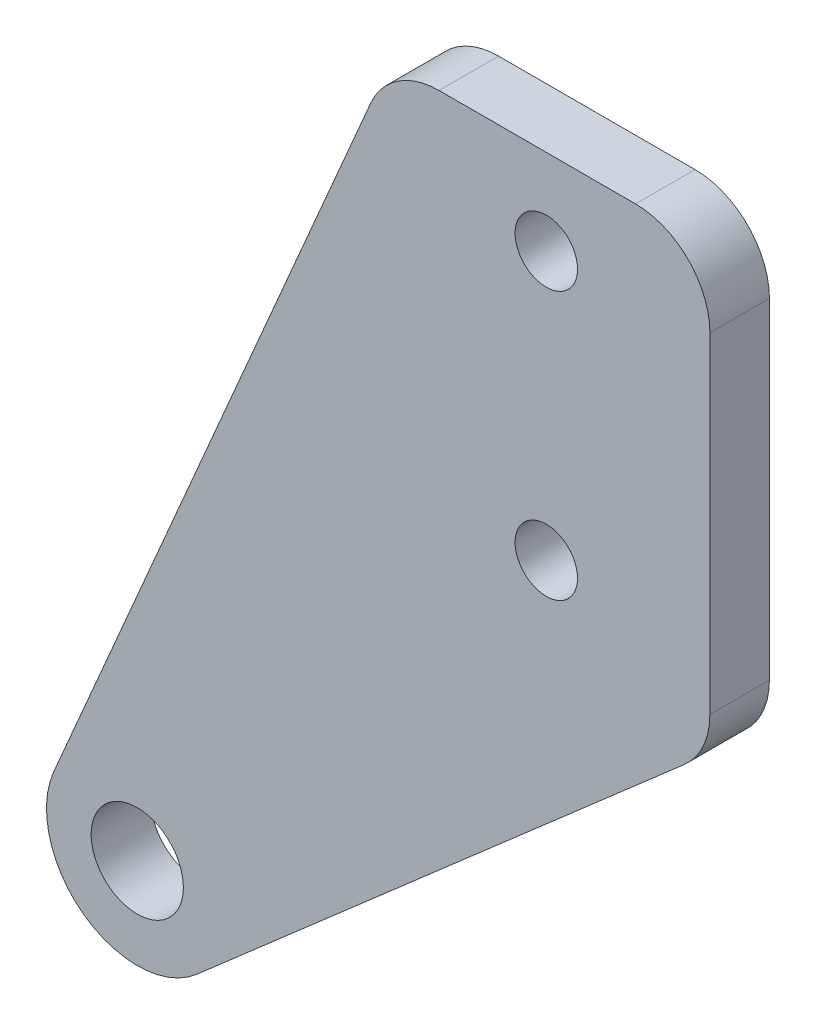
ISO-10303-21;
HEADER;
FILE_DESCRIPTION(('STEP AP214'),'2;1');
FILE_NAME('part.step','',(''),(''),'','','');
FILE_SCHEMA(('AUTOMOTIVE_DESIGN { 1 0 10303 214 1 1 1 1 }'));
ENDSEC;
DATA;
#1=APPLICATION_CONTEXT('core data for automotive mechanical design processes');
#2=APPLICATION_PROTOCOL_DEFINITION('international standard','automotive_design',2000,#1);
#3=PRODUCT_CONTEXT('',#1,'mechanical');
#4=PRODUCT('Part','Part','',(#3));
#5=PRODUCT_RELATED_PRODUCT_CATEGORY('part','',(#4));
#6=PRODUCT_DEFINITION_FORMATION('','',#4);
#7=PRODUCT_DEFINITION_CONTEXT('part definition',#1,'design');
#8=PRODUCT_DEFINITION('design','',#6,#7);
#9=PRODUCT_DEFINITION_SHAPE('','',#8);
#10=(LENGTH_UNIT() NAMED_UNIT(*) SI_UNIT(.MILLI.,.METRE.));
#11=(NAMED_UNIT(*) PLANE_ANGLE_UNIT() SI_UNIT($,.RADIAN.));
#12=(NAMED_UNIT(*) SI_UNIT($,.STERADIAN.) SOLID_ANGLE_UNIT());
#13=UNCERTAINTY_MEASURE_WITH_UNIT(LENGTH_MEASURE(1.E-05),#10,'distance_accuracy_value','');
#14=(GEOMETRIC_REPRESENTATION_CONTEXT(3) GLOBAL_UNCERTAINTY_ASSIGNED_CONTEXT((#13)) GLOBAL_UNIT_ASSIGNED_CONTEXT((#10,
#11,#12)) REPRESENTATION_CONTEXT('',''));
#15=CARTESIAN_POINT('',(0.,0.,0.));
#16=DIRECTION('',(0.,0.,1.));
#17=DIRECTION('',(1.,0.,0.));
#18=AXIS2_PLACEMENT_3D('',#15,#16,#17);
#19=CARTESIAN_POINT('',(10.3331114739695,-11.8414541399534,4.));
#20=DIRECTION('',(-0.657489150580782,0.753464011661182,0.));
#21=DIRECTION('',(-0.753464011661182,-0.657489150580782,0.));
#22=AXIS2_PLACEMENT_3D('',#19,#20,#21);
#23=PLANE('',#22);
#24=DIRECTION('',(0.753464011661182,0.657489150580782,0.));
#25=VECTOR('',#24,1.);
#26=CARTESIAN_POINT('',(10.3331114739695,-11.8414541399534,0.));
#27=LINE('',#26,#25);
#28=CARTESIAN_POINT('',(-27.4893161814572,-44.8461304711332,0.));
#29=VERTEX_POINT('',#28);
#30=CARTESIAN_POINT('',(5.28744575290391,-16.2444122344533,0.));
#31=VERTEX_POINT('',#30);
#32=EDGE_CURVE('E138',#29,#31,#27,.T.);
#33=ORIENTED_EDGE('',*,*,#32,.T.);
#34=DIRECTION('',(0.,0.,-1.));
#35=VECTOR('',#34,1.);
#36=CARTESIAN_POINT('',(5.28744575290391,-16.2444122344533,4.));
#37=LINE('',#36,#35);
#38=CARTESIAN_POINT('',(5.28744575290391,-16.2444122344533,4.));
#39=VERTEX_POINT('',#38);
#40=EDGE_CURVE('E46',#31,#39,#37,.F.);
#41=ORIENTED_EDGE('',*,*,#40,.T.);
#42=DIRECTION('',(0.753464011661182,0.657489150580782,0.));
#43=VECTOR('',#42,1.);
#44=CARTESIAN_POINT('',(10.3331114739695,-11.8414541399534,4.));
#45=LINE('',#44,#43);
#46=CARTESIAN_POINT('',(-27.4893161814572,-44.8461304711332,4.));
#47=VERTEX_POINT('',#46);
#48=EDGE_CURVE('E158',#47,#39,#45,.T.);
#49=ORIENTED_EDGE('',*,*,#48,.F.);
#50=DIRECTION('',(0.,0.,-1.));
#51=VECTOR('',#50,1.);
#52=CARTESIAN_POINT('',(-27.4893161814572,-44.8461304711332,4.));
#53=LINE('',#52,#51);
#54=EDGE_CURVE('E122',#47,#29,#53,.T.);
#55=ORIENTED_EDGE('',*,*,#54,.T.);
#56=EDGE_LOOP('',(#33,#41,#49,#55));
#57=FACE_BOUND('',#56,.T.);
#58=ADVANCED_FACE('F38',(#57),#23,.F.);
#59=CARTESIAN_POINT('',(7.,0.,4.));
#60=DIRECTION('',(-1.,0.,0.));
#61=DIRECTION('',(0.,0.,1.));
#62=AXIS2_PLACEMENT_3D('',#59,#60,#61);
#63=PLANE('',#62);
#64=DIRECTION('',(0.,1.,0.));
#65=VECTOR('',#64,1.);
#66=CARTESIAN_POINT('',(7.,0.,0.));
#67=LINE('',#66,#65);
#68=CARTESIAN_POINT('',(7.,-12.4770921761474,0.));
#69=VERTEX_POINT('',#68);
#70=CARTESIAN_POINT('',(7.,9.75,0.));
#71=VERTEX_POINT('',#70);
#72=EDGE_CURVE('E140',#69,#71,#67,.T.);
#73=ORIENTED_EDGE('',*,*,#72,.T.);
#74=DIRECTION('',(0.,0.,-1.));
#75=VECTOR('',#74,1.);
#76=CARTESIAN_POINT('',(7.,9.75,4.));
#77=LINE('',#76,#75);
#78=CARTESIAN_POINT('',(7.,9.75,4.));
#79=VERTEX_POINT('',#78);
#80=EDGE_CURVE('E173',#71,#79,#77,.F.);
#81=ORIENTED_EDGE('',*,*,#80,.T.);
#82=DIRECTION('',(0.,1.,0.));
#83=VECTOR('',#82,1.);
#84=CARTESIAN_POINT('',(7.,0.,4.));
#85=LINE('',#84,#83);
#86=CARTESIAN_POINT('',(7.,-12.4770921761474,4.));
#87=VERTEX_POINT('',#86);
#88=EDGE_CURVE('E182',#87,#79,#85,.T.);
#89=ORIENTED_EDGE('',*,*,#88,.F.);
#90=DIRECTION('',(0.,0.,-1.));
#91=VECTOR('',#90,1.);
#92=CARTESIAN_POINT('',(7.,-12.4770921761474,4.));
#93=LINE('',#92,#91);
#94=EDGE_CURVE('E170',#87,#69,#93,.T.);
#95=ORIENTED_EDGE('',*,*,#94,.T.);
#96=EDGE_LOOP('',(#73,#81,#89,#95));
#97=FACE_BOUND('',#96,.T.);
#98=ADVANCED_FACE('F196',(#97),#63,.F.);
#99=CARTESIAN_POINT('',(0.,14.75,4.));
#100=DIRECTION('',(0.,1.,0.));
#101=DIRECTION('',(0.,0.,1.));
#102=AXIS2_PLACEMENT_3D('',#99,#100,#101);
#103=PLANE('',#102);
#104=DIRECTION('',(1.,0.,0.));
#105=VECTOR('',#104,1.);
#106=CARTESIAN_POINT('',(0.,14.75,4.));
#107=LINE('',#106,#105);
#108=CARTESIAN_POINT('',(-11.2067714502846,14.75,4.));
#109=VERTEX_POINT('',#108);
#110=CARTESIAN_POINT('',(2.,14.75,4.));
#111=VERTEX_POINT('',#110);
#112=EDGE_CURVE('E112',#109,#111,#107,.T.);
#113=ORIENTED_EDGE('',*,*,#112,.T.);
#114=DIRECTION('',(0.,0.,-1.));
#115=VECTOR('',#114,1.);
#116=CARTESIAN_POINT('',(2.,14.75,0.));
#117=LINE('',#116,#115);
#118=CARTESIAN_POINT('',(2.,14.75,0.));
#119=VERTEX_POINT('',#118);
#120=EDGE_CURVE('E161',#111,#119,#117,.T.);
#121=ORIENTED_EDGE('',*,*,#120,.T.);
#122=DIRECTION('',(1.,0.,0.));
#123=VECTOR('',#122,1.);
#124=CARTESIAN_POINT('',(0.,14.75,0.));
#125=LINE('',#124,#123);
#126=CARTESIAN_POINT('',(-11.2067714502846,14.75,0.));
#127=VERTEX_POINT('',#126);
#128=EDGE_CURVE('E143',#127,#119,#125,.T.);
#129=ORIENTED_EDGE('',*,*,#128,.F.);
#130=DIRECTION('',(0.,0.,-1.));
#131=VECTOR('',#130,1.);
#132=CARTESIAN_POINT('',(-11.2067714502846,14.75,4.));
#133=LINE('',#132,#131);
#134=EDGE_CURVE('E121',#127,#109,#133,.F.);
#135=ORIENTED_EDGE('',*,*,#134,.T.);
#136=EDGE_LOOP('',(#113,#121,#129,#135));
#137=FACE_BOUND('',#136,.T.);
#138=ADVANCED_FACE('F187',(#137),#103,.T.);
#139=CARTESIAN_POINT('',(-17.5901518014723,7.56043387637797,4.));
#140=DIRECTION('',(0.918732319934744,-0.394880898888921,0.));
#141=DIRECTION('',(0.394880898888921,0.918732319934745,0.));
#142=AXIS2_PLACEMENT_3D('',#139,#140,#141);
#143=PLANE('',#142);
#144=DIRECTION('',(-0.394880898888921,-0.918732319934745,0.));
#145=VECTOR('',#144,1.);
#146=CARTESIAN_POINT('',(-17.5901518014723,7.56043387637797,4.));
#147=LINE('',#146,#145);
#148=CARTESIAN_POINT('',(-15.8004330499583,11.7244044944446,4.));
#149=VERTEX_POINT('',#148);
#150=CARTESIAN_POINT('',(-37.104267151602,-37.8412265167776,4.));
#151=VERTEX_POINT('',#150);
#152=EDGE_CURVE('E102',#149,#151,#147,.T.);
#153=ORIENTED_EDGE('',*,*,#152,.F.);
#154=DIRECTION('',(0.,0.,-1.));
#155=VECTOR('',#154,1.);
#156=CARTESIAN_POINT('',(-15.8004330499583,11.7244044944446,0.));
#157=LINE('',#156,#155);
#158=CARTESIAN_POINT('',(-15.8004330499583,11.7244044944446,0.));
#159=VERTEX_POINT('',#158);
#160=EDGE_CURVE('E11',#149,#159,#157,.T.);
#161=ORIENTED_EDGE('',*,*,#160,.T.);
#162=DIRECTION('',(-0.394880898888921,-0.918732319934745,0.));
#163=VECTOR('',#162,1.);
#164=CARTESIAN_POINT('',(-17.5901518014723,7.56043387637797,0.));
#165=LINE('',#164,#163);
#166=CARTESIAN_POINT('',(-37.104267151602,-37.8412265167776,0.));
#167=VERTEX_POINT('',#166);
#168=EDGE_CURVE('E118',#159,#167,#165,.T.);
#169=ORIENTED_EDGE('',*,*,#168,.T.);
#170=DIRECTION('',(0.,0.,-1.));
#171=VECTOR('',#170,1.);
#172=CARTESIAN_POINT('',(-37.104267151602,-37.8412265167776,4.));
#173=LINE('',#172,#171);
#174=EDGE_CURVE('E115',#151,#167,#173,.T.);
#175=ORIENTED_EDGE('',*,*,#174,.F.);
#176=EDGE_LOOP('',(#153,#161,#169,#175));
#177=FACE_BOUND('',#176,.T.);
#178=ADVANCED_FACE('F116',(#177),#143,.F.);
#179=CARTESIAN_POINT('',(-4.,9.,4.));
#180=DIRECTION('',(0.,0.,-1.));
#181=DIRECTION('',(-1.,0.,0.));
#182=AXIS2_PLACEMENT_3D('',#179,#180,#181);
#183=CYLINDRICAL_SURFACE('',#182,2.1);
#184=CARTESIAN_POINT('',(-4.,9.,4.));
#185=DIRECTION('',(0.,0.,1.));
#186=DIRECTION('',(1.,0.,0.));
#187=AXIS2_PLACEMENT_3D('',#184,#185,#186);
#188=CIRCLE('',#187,2.1);
#189=CARTESIAN_POINT('',(-1.9,9.,4.));
#190=VERTEX_POINT('',#189);
#191=EDGE_CURVE('E129',#190,#190,#188,.T.);
#192=ORIENTED_EDGE('',*,*,#191,.T.);
#193=EDGE_LOOP('',(#192));
#194=FACE_BOUND('',#193,.T.);
#195=CARTESIAN_POINT('',(-4.,9.,0.));
#196=DIRECTION('',(0.,0.,1.));
#197=DIRECTION('',(1.,0.,0.));
#198=AXIS2_PLACEMENT_3D('',#195,#196,#197);
#199=CIRCLE('',#198,2.1);
#200=CARTESIAN_POINT('',(-1.9,9.,0.));
#201=VERTEX_POINT('',#200);
#202=EDGE_CURVE('E152',#201,#201,#199,.T.);
#203=ORIENTED_EDGE('',*,*,#202,.F.);
#204=EDGE_LOOP('',(#203));
#205=FACE_BOUND('',#204,.T.);
#206=ADVANCED_FACE('F259',(#194,#205),#183,.F.);
#207=CARTESIAN_POINT('',(-4.,-9.,4.));
#208=DIRECTION('',(0.,0.,-1.));
#209=DIRECTION('',(-1.,0.,0.));
#210=AXIS2_PLACEMENT_3D('',#207,#208,#209);
#211=CYLINDRICAL_SURFACE('',#210,2.1);
#212=CARTESIAN_POINT('',(-4.,-9.,4.));
#213=DIRECTION('',(0.,0.,1.));
#214=DIRECTION('',(1.,0.,0.));
#215=AXIS2_PLACEMENT_3D('',#212,#213,#214);
#216=CIRCLE('',#215,2.1);
#217=CARTESIAN_POINT('',(-1.9,-9.,4.));
#218=VERTEX_POINT('',#217);
#219=EDGE_CURVE('E126',#218,#218,#216,.T.);
#220=ORIENTED_EDGE('',*,*,#219,.T.);
#221=EDGE_LOOP('',(#220));
#222=FACE_BOUND('',#221,.T.);
#223=CARTESIAN_POINT('',(-4.,-9.,0.));
#224=DIRECTION('',(0.,0.,1.));
#225=DIRECTION('',(1.,0.,0.));
#226=AXIS2_PLACEMENT_3D('',#223,#224,#225);
#227=CIRCLE('',#226,2.1);
#228=CARTESIAN_POINT('',(-1.9,-9.,0.));
#229=VERTEX_POINT('',#228);
#230=EDGE_CURVE('E149',#229,#229,#227,.T.);
#231=ORIENTED_EDGE('',*,*,#230,.F.);
#232=EDGE_LOOP('',(#231));
#233=FACE_BOUND('',#232,.T.);
#234=ADVANCED_FACE('F295',(#222,#233),#211,.F.);
#235=CARTESIAN_POINT('',(-31.5,-40.25,4.));
#236=DIRECTION('',(0.,0.,-1.));
#237=DIRECTION('',(-1.,0.,0.));
#238=AXIS2_PLACEMENT_3D('',#235,#236,#237);
#239=CYLINDRICAL_SURFACE('',#238,6.1);
#240=CARTESIAN_POINT('',(-31.5,-40.25,0.));
#241=DIRECTION('',(0.,0.,1.));
#242=DIRECTION('',(1.,0.,0.));
#243=AXIS2_PLACEMENT_3D('',#240,#241,#242);
#244=CIRCLE('',#243,6.1);
#245=EDGE_CURVE('E147',#167,#29,#244,.T.);
#246=ORIENTED_EDGE('',*,*,#245,.T.);
#247=ORIENTED_EDGE('',*,*,#54,.F.);
#248=CARTESIAN_POINT('',(-31.5,-40.25,4.));
#249=DIRECTION('',(0.,0.,1.));
#250=DIRECTION('',(1.,0.,0.));
#251=AXIS2_PLACEMENT_3D('',#248,#249,#250);
#252=CIRCLE('',#251,6.1);
#253=EDGE_CURVE('E108',#151,#47,#252,.T.);
#254=ORIENTED_EDGE('',*,*,#253,.F.);
#255=ORIENTED_EDGE('',*,*,#174,.T.);
#256=EDGE_LOOP('',(#246,#247,#254,#255));
#257=FACE_BOUND('',#256,.T.);
#258=ADVANCED_FACE('F124',(#257),#239,.T.);
#259=CARTESIAN_POINT('',(-31.5,-40.25,4.));
#260=DIRECTION('',(0.,0.,-1.));
#261=DIRECTION('',(-1.,0.,0.));
#262=AXIS2_PLACEMENT_3D('',#259,#260,#261);
#263=CYLINDRICAL_SURFACE('',#262,3.1);
#264=CARTESIAN_POINT('',(-31.5,-40.25,4.));
#265=DIRECTION('',(0.,0.,1.));
#266=DIRECTION('',(1.,0.,0.));
#267=AXIS2_PLACEMENT_3D('',#264,#265,#266);
#268=CIRCLE('',#267,3.1);
#269=CARTESIAN_POINT('',(-28.4,-40.25,4.));
#270=VERTEX_POINT('',#269);
#271=EDGE_CURVE('E135',#270,#270,#268,.T.);
#272=ORIENTED_EDGE('',*,*,#271,.T.);
#273=EDGE_LOOP('',(#272));
#274=FACE_BOUND('',#273,.T.);
#275=CARTESIAN_POINT('',(-31.5,-40.25,0.));
#276=DIRECTION('',(0.,0.,1.));
#277=DIRECTION('',(1.,0.,0.));
#278=AXIS2_PLACEMENT_3D('',#275,#276,#277);
#279=CIRCLE('',#278,3.1);
#280=CARTESIAN_POINT('',(-28.4,-40.25,0.));
#281=VERTEX_POINT('',#280);
#282=EDGE_CURVE('E155',#281,#281,#279,.T.);
#283=ORIENTED_EDGE('',*,*,#282,.F.);
#284=EDGE_LOOP('',(#283));
#285=FACE_BOUND('',#284,.T.);
#286=ADVANCED_FACE('F248',(#274,#285),#263,.F.);
#287=CARTESIAN_POINT('',(0.,0.,4.));
#288=DIRECTION('',(0.,0.,1.));
#289=DIRECTION('',(1.,0.,0.));
#290=AXIS2_PLACEMENT_3D('',#287,#288,#289);
#291=PLANE('',#290);
#292=ORIENTED_EDGE('',*,*,#88,.T.);
#293=CARTESIAN_POINT('',(2.,9.75,4.));
#294=DIRECTION('',(0.,0.,1.));
#295=DIRECTION('',(1.,0.,0.));
#296=AXIS2_PLACEMENT_3D('',#293,#294,#295);
#297=CIRCLE('',#296,5.);
#298=EDGE_CURVE('E178',#79,#111,#297,.T.);
#299=ORIENTED_EDGE('',*,*,#298,.T.);
#300=ORIENTED_EDGE('',*,*,#112,.F.);
#301=CARTESIAN_POINT('',(-11.2067714502846,9.75,4.));
#302=DIRECTION('',(0.,0.,1.));
#303=DIRECTION('',(1.,0.,0.));
#304=AXIS2_PLACEMENT_3D('',#301,#302,#303);
#305=CIRCLE('',#304,5.);
#306=EDGE_CURVE('E53',#109,#149,#305,.T.);
#307=ORIENTED_EDGE('',*,*,#306,.T.);
#308=ORIENTED_EDGE('',*,*,#152,.T.);
#309=ORIENTED_EDGE('',*,*,#253,.T.);
#310=ORIENTED_EDGE('',*,*,#48,.T.);
#311=CARTESIAN_POINT('',(2.,-12.4770921761474,4.));
#312=DIRECTION('',(0.,0.,1.));
#313=DIRECTION('',(1.,0.,0.));
#314=AXIS2_PLACEMENT_3D('',#311,#312,#313);
#315=CIRCLE('',#314,5.);
#316=EDGE_CURVE('E176',#39,#87,#315,.T.);
#317=ORIENTED_EDGE('',*,*,#316,.T.);
#318=EDGE_LOOP('',(#292,#299,#300,#307,#308,#309,#310,#317));
#319=FACE_BOUND('',#318,.T.);
#320=ORIENTED_EDGE('',*,*,#219,.F.);
#321=EDGE_LOOP('',(#320));
#322=FACE_BOUND('',#321,.T.);
#323=ORIENTED_EDGE('',*,*,#191,.F.);
#324=EDGE_LOOP('',(#323));
#325=FACE_BOUND('',#324,.T.);
#326=ORIENTED_EDGE('',*,*,#271,.F.);
#327=EDGE_LOOP('',(#326));
#328=FACE_BOUND('',#327,.T.);
#329=ADVANCED_FACE('F105',(#319,#322,#325,#328),#291,.T.);
#330=CARTESIAN_POINT('',(0.,0.,0.));
#331=DIRECTION('',(0.,0.,1.));
#332=DIRECTION('',(1.,0.,0.));
#333=AXIS2_PLACEMENT_3D('',#330,#331,#332);
#334=PLANE('',#333);
#335=ORIENTED_EDGE('',*,*,#128,.T.);
#336=CARTESIAN_POINT('',(2.,9.75,0.));
#337=DIRECTION('',(0.,0.,1.));
#338=DIRECTION('',(1.,0.,0.));
#339=AXIS2_PLACEMENT_3D('',#336,#337,#338);
#340=CIRCLE('',#339,5.);
#341=EDGE_CURVE('E168',#119,#71,#340,.F.);
#342=ORIENTED_EDGE('',*,*,#341,.T.);
#343=ORIENTED_EDGE('',*,*,#72,.F.);
#344=CARTESIAN_POINT('',(2.,-12.4770921761474,0.));
#345=DIRECTION('',(0.,0.,1.));
#346=DIRECTION('',(1.,0.,0.));
#347=AXIS2_PLACEMENT_3D('',#344,#345,#346);
#348=CIRCLE('',#347,5.);
#349=EDGE_CURVE('E166',#69,#31,#348,.F.);
#350=ORIENTED_EDGE('',*,*,#349,.T.);
#351=ORIENTED_EDGE('',*,*,#32,.F.);
#352=ORIENTED_EDGE('',*,*,#245,.F.);
#353=ORIENTED_EDGE('',*,*,#168,.F.);
#354=CARTESIAN_POINT('',(-11.2067714502846,9.75,0.));
#355=DIRECTION('',(0.,0.,1.));
#356=DIRECTION('',(1.,0.,0.));
#357=AXIS2_PLACEMENT_3D('',#354,#355,#356);
#358=CIRCLE('',#357,5.);
#359=EDGE_CURVE('E164',#159,#127,#358,.F.);
#360=ORIENTED_EDGE('',*,*,#359,.T.);
#361=EDGE_LOOP('',(#335,#342,#343,#350,#351,#352,#353,#360));
#362=FACE_BOUND('',#361,.T.);
#363=ORIENTED_EDGE('',*,*,#230,.T.);
#364=EDGE_LOOP('',(#363));
#365=FACE_BOUND('',#364,.T.);
#366=ORIENTED_EDGE('',*,*,#202,.T.);
#367=EDGE_LOOP('',(#366));
#368=FACE_BOUND('',#367,.T.);
#369=ORIENTED_EDGE('',*,*,#282,.T.);
#370=EDGE_LOOP('',(#369));
#371=FACE_BOUND('',#370,.T.);
#372=ADVANCED_FACE('F193',(#362,#365,#368,#371),#334,.F.);
#373=CARTESIAN_POINT('',(2.,9.75,4.));
#374=DIRECTION('',(0.,0.,1.));
#375=DIRECTION('',(1.,0.,0.));
#376=AXIS2_PLACEMENT_3D('',#373,#374,#375);
#377=CYLINDRICAL_SURFACE('',#376,5.);
#378=ORIENTED_EDGE('',*,*,#298,.F.);
#379=ORIENTED_EDGE('',*,*,#80,.F.);
#380=ORIENTED_EDGE('',*,*,#341,.F.);
#381=ORIENTED_EDGE('',*,*,#120,.F.);
#382=EDGE_LOOP('',(#378,#379,#380,#381));
#383=FACE_BOUND('',#382,.T.);
#384=ADVANCED_FACE('F190',(#383),#377,.T.);
#385=CARTESIAN_POINT('',(2.,-12.4770921761474,4.));
#386=DIRECTION('',(0.,0.,-1.));
#387=DIRECTION('',(-1.,0.,0.));
#388=AXIS2_PLACEMENT_3D('',#385,#386,#387);
#389=CYLINDRICAL_SURFACE('',#388,5.);
#390=ORIENTED_EDGE('',*,*,#316,.F.);
#391=ORIENTED_EDGE('',*,*,#40,.F.);
#392=ORIENTED_EDGE('',*,*,#349,.F.);
#393=ORIENTED_EDGE('',*,*,#94,.F.);
#394=EDGE_LOOP('',(#390,#391,#392,#393));
#395=FACE_BOUND('',#394,.T.);
#396=ADVANCED_FACE('F200',(#395),#389,.T.);
#397=CARTESIAN_POINT('',(-11.2067714502846,9.75,4.));
#398=DIRECTION('',(0.,0.,1.));
#399=DIRECTION('',(1.,0.,0.));
#400=AXIS2_PLACEMENT_3D('',#397,#398,#399);
#401=CYLINDRICAL_SURFACE('',#400,5.);
#402=ORIENTED_EDGE('',*,*,#306,.F.);
#403=ORIENTED_EDGE('',*,*,#134,.F.);
#404=ORIENTED_EDGE('',*,*,#359,.F.);
#405=ORIENTED_EDGE('',*,*,#160,.F.);
#406=EDGE_LOOP('',(#402,#403,#404,#405));
#407=FACE_BOUND('',#406,.T.);
#408=ADVANCED_FACE('F40',(#407),#401,.T.);
#409=CLOSED_SHELL('',(#58,#98,#138,#178,#206,#234,#258,#286,#329,#372,#384,#396,#408));
#410=MANIFOLD_SOLID_BREP('B2',#409);
#411=ADVANCED_BREP_SHAPE_REPRESENTATION('',(#18,#410),#14);
#412=SHAPE_DEFINITION_REPRESENTATION(#9,#411);
ENDSEC;
END-ISO-10303-21;
